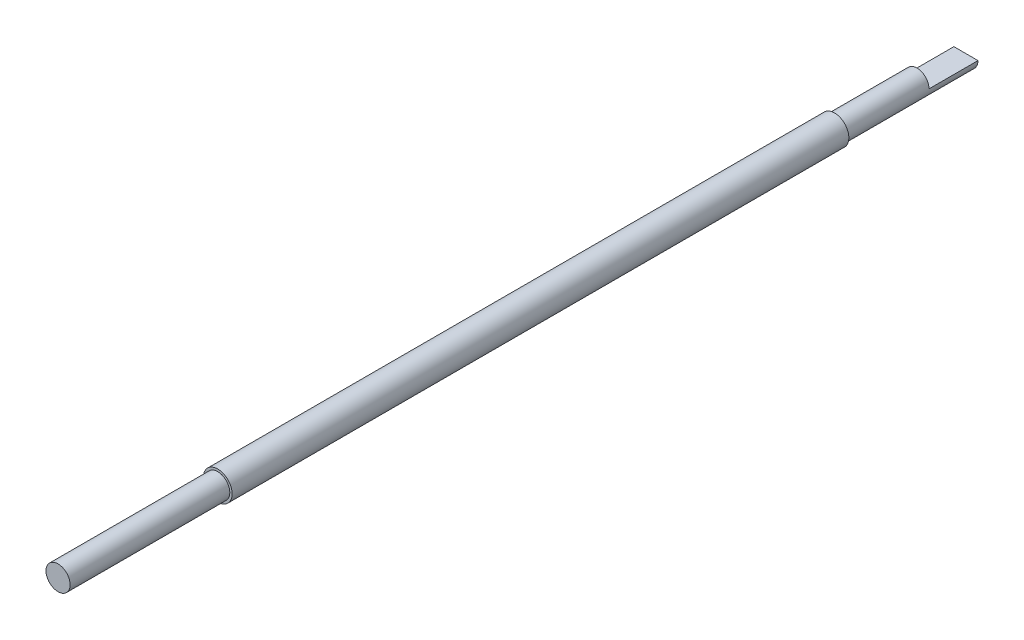
ISO-10303-21;
HEADER;
FILE_DESCRIPTION(('STEP AP214'),'2;1');
FILE_NAME('part.step','',(''),(''),'','','');
FILE_SCHEMA(('AUTOMOTIVE_DESIGN { 1 0 10303 214 1 1 1 1 }'));
ENDSEC;
DATA;
#1=APPLICATION_CONTEXT('core data for automotive mechanical design processes');
#2=APPLICATION_PROTOCOL_DEFINITION('international standard','automotive_design',2000,#1);
#3=PRODUCT_CONTEXT('',#1,'mechanical');
#4=PRODUCT('Part','Part','',(#3));
#5=PRODUCT_RELATED_PRODUCT_CATEGORY('part','',(#4));
#6=PRODUCT_DEFINITION_FORMATION('','',#4);
#7=PRODUCT_DEFINITION_CONTEXT('part definition',#1,'design');
#8=PRODUCT_DEFINITION('design','',#6,#7);
#9=PRODUCT_DEFINITION_SHAPE('','',#8);
#10=(LENGTH_UNIT() NAMED_UNIT(*) SI_UNIT(.MILLI.,.METRE.));
#11=(NAMED_UNIT(*) PLANE_ANGLE_UNIT() SI_UNIT($,.RADIAN.));
#12=(NAMED_UNIT(*) SI_UNIT($,.STERADIAN.) SOLID_ANGLE_UNIT());
#13=UNCERTAINTY_MEASURE_WITH_UNIT(LENGTH_MEASURE(1.E-05),#10,'distance_accuracy_value','');
#14=(GEOMETRIC_REPRESENTATION_CONTEXT(3) GLOBAL_UNCERTAINTY_ASSIGNED_CONTEXT((#13)) GLOBAL_UNIT_ASSIGNED_CONTEXT((#10,
#11,#12)) REPRESENTATION_CONTEXT('',''));
#15=CARTESIAN_POINT('',(0.,0.,0.));
#16=DIRECTION('',(0.,0.,1.));
#17=DIRECTION('',(1.,0.,0.));
#18=AXIS2_PLACEMENT_3D('',#15,#16,#17);
#19=CARTESIAN_POINT('',(0.,0.,301.26));
#20=DIRECTION('',(0.,0.,-1.));
#21=DIRECTION('',(-1.,0.,0.));
#22=AXIS2_PLACEMENT_3D('',#19,#20,#21);
#23=CYLINDRICAL_SURFACE('',#22,4.7625);
#24=CARTESIAN_POINT('',(0.,0.,43.61));
#25=DIRECTION('',(0.,0.,-1.));
#26=DIRECTION('',(-1.,0.,0.));
#27=AXIS2_PLACEMENT_3D('',#24,#25,#26);
#28=CIRCLE('',#27,4.7625);
#29=CARTESIAN_POINT('',(-4.7625,0.,43.61));
#30=VERTEX_POINT('',#29);
#31=EDGE_CURVE('E11',#30,#30,#28,.T.);
#32=ORIENTED_EDGE('',*,*,#31,.F.);
#33=EDGE_LOOP('',(#32));
#34=FACE_BOUND('',#33,.T.);
#35=CARTESIAN_POINT('',(0.,0.,248.26));
#36=DIRECTION('',(0.,0.,1.));
#37=DIRECTION('',(1.,0.,0.));
#38=AXIS2_PLACEMENT_3D('',#35,#36,#37);
#39=CIRCLE('',#38,4.7625);
#40=CARTESIAN_POINT('',(4.7625,0.,248.26));
#41=VERTEX_POINT('',#40);
#42=EDGE_CURVE('E66',#41,#41,#39,.T.);
#43=ORIENTED_EDGE('',*,*,#42,.F.);
#44=EDGE_LOOP('',(#43));
#45=FACE_BOUND('',#44,.T.);
#46=ADVANCED_FACE('F35',(#34,#45),#23,.T.);
#47=CARTESIAN_POINT('',(0.,0.,43.61));
#48=DIRECTION('',(0.,0.,-1.));
#49=DIRECTION('',(-1.,0.,0.));
#50=AXIS2_PLACEMENT_3D('',#47,#48,#49);
#51=PLANE('',#50);
#52=CARTESIAN_POINT('',(0.,0.,43.61));
#53=DIRECTION('',(0.,0.,-1.));
#54=DIRECTION('',(-1.,0.,0.));
#55=AXIS2_PLACEMENT_3D('',#52,#53,#54);
#56=CIRCLE('',#55,4.);
#57=CARTESIAN_POINT('',(-4.,0.,43.61));
#58=VERTEX_POINT('',#57);
#59=EDGE_CURVE('E42',#58,#58,#56,.T.);
#60=ORIENTED_EDGE('',*,*,#59,.F.);
#61=EDGE_LOOP('',(#60));
#62=FACE_BOUND('',#61,.T.);
#63=ORIENTED_EDGE('',*,*,#31,.T.);
#64=EDGE_LOOP('',(#63));
#65=FACE_BOUND('',#64,.T.);
#66=ADVANCED_FACE('F102',(#62,#65),#51,.T.);
#67=CARTESIAN_POINT('',(0.,0.,43.61));
#68=DIRECTION('',(0.,0.,-1.));
#69=DIRECTION('',(-1.,0.,0.));
#70=AXIS2_PLACEMENT_3D('',#67,#68,#69);
#71=CYLINDRICAL_SURFACE('',#70,4.);
#72=DIRECTION('',(0.,0.,-1.));
#73=VECTOR('',#72,1.);
#74=CARTESIAN_POINT('',(-4.,0.,16.26));
#75=LINE('',#74,#73);
#76=CARTESIAN_POINT('',(-4.,0.,16.26));
#77=VERTEX_POINT('',#76);
#78=CARTESIAN_POINT('',(-4.,0.,0.));
#79=VERTEX_POINT('',#78);
#80=EDGE_CURVE('E55',#77,#79,#75,.T.);
#81=ORIENTED_EDGE('',*,*,#80,.T.);
#82=CARTESIAN_POINT('',(0.,0.,0.));
#83=DIRECTION('',(0.,0.,-1.));
#84=DIRECTION('',(-1.,0.,0.));
#85=AXIS2_PLACEMENT_3D('',#82,#83,#84);
#86=CIRCLE('',#85,4.);
#87=CARTESIAN_POINT('',(4.,0.,0.));
#88=VERTEX_POINT('',#87);
#89=EDGE_CURVE('E72',#88,#79,#86,.T.);
#90=ORIENTED_EDGE('',*,*,#89,.F.);
#91=DIRECTION('',(0.,0.,-1.));
#92=VECTOR('',#91,1.);
#93=CARTESIAN_POINT('',(4.,0.,16.26));
#94=LINE('',#93,#92);
#95=CARTESIAN_POINT('',(4.,0.,16.26));
#96=VERTEX_POINT('',#95);
#97=EDGE_CURVE('E49',#96,#88,#94,.T.);
#98=ORIENTED_EDGE('',*,*,#97,.F.);
#99=CARTESIAN_POINT('',(0.,0.,16.26));
#100=DIRECTION('',(0.,0.,-1.));
#101=DIRECTION('',(-1.,0.,0.));
#102=AXIS2_PLACEMENT_3D('',#99,#100,#101);
#103=CIRCLE('',#102,4.);
#104=EDGE_CURVE('E65',#77,#96,#103,.T.);
#105=ORIENTED_EDGE('',*,*,#104,.F.);
#106=EDGE_LOOP('',(#81,#90,#98,#105));
#107=FACE_BOUND('',#106,.T.);
#108=ORIENTED_EDGE('',*,*,#59,.T.);
#109=EDGE_LOOP('',(#108));
#110=FACE_BOUND('',#109,.T.);
#111=ADVANCED_FACE('F70',(#107,#110),#71,.T.);
#112=CARTESIAN_POINT('',(0.,0.,0.));
#113=DIRECTION('',(0.,0.,1.));
#114=DIRECTION('',(1.,0.,0.));
#115=AXIS2_PLACEMENT_3D('',#112,#113,#114);
#116=PLANE('',#115);
#117=ORIENTED_EDGE('',*,*,#89,.T.);
#118=DIRECTION('',(-1.,0.,0.));
#119=VECTOR('',#118,1.);
#120=CARTESIAN_POINT('',(0.,0.,0.));
#121=LINE('',#120,#119);
#122=EDGE_CURVE('E60',#88,#79,#121,.T.);
#123=ORIENTED_EDGE('',*,*,#122,.F.);
#124=EDGE_LOOP('',(#117,#123));
#125=FACE_BOUND('',#124,.T.);
#126=ADVANCED_FACE('F74',(#125),#116,.F.);
#127=CARTESIAN_POINT('',(0.,0.,16.26));
#128=DIRECTION('',(0.,-1.,0.));
#129=DIRECTION('',(0.,0.,-1.));
#130=AXIS2_PLACEMENT_3D('',#127,#128,#129);
#131=PLANE('',#130);
#132=ORIENTED_EDGE('',*,*,#122,.T.);
#133=ORIENTED_EDGE('',*,*,#80,.F.);
#134=DIRECTION('',(-1.,0.,0.));
#135=VECTOR('',#134,1.);
#136=CARTESIAN_POINT('',(0.,0.,16.26));
#137=LINE('',#136,#135);
#138=EDGE_CURVE('E78',#96,#77,#137,.T.);
#139=ORIENTED_EDGE('',*,*,#138,.F.);
#140=ORIENTED_EDGE('',*,*,#97,.T.);
#141=EDGE_LOOP('',(#132,#133,#139,#140));
#142=FACE_BOUND('',#141,.T.);
#143=ADVANCED_FACE('F61',(#142),#131,.F.);
#144=CARTESIAN_POINT('',(0.,0.,16.26));
#145=DIRECTION('',(0.,0.,-1.));
#146=DIRECTION('',(-1.,0.,0.));
#147=AXIS2_PLACEMENT_3D('',#144,#145,#146);
#148=PLANE('',#147);
#149=ORIENTED_EDGE('',*,*,#104,.T.);
#150=ORIENTED_EDGE('',*,*,#138,.T.);
#151=EDGE_LOOP('',(#149,#150));
#152=FACE_BOUND('',#151,.T.);
#153=ADVANCED_FACE('F97',(#152),#148,.T.);
#154=CARTESIAN_POINT('',(0.,0.,248.26));
#155=DIRECTION('',(0.,0.,1.));
#156=DIRECTION('',(1.,0.,0.));
#157=AXIS2_PLACEMENT_3D('',#154,#155,#156);
#158=PLANE('',#157);
#159=CARTESIAN_POINT('',(0.,0.,248.26));
#160=DIRECTION('',(0.,0.,1.));
#161=DIRECTION('',(1.,0.,0.));
#162=AXIS2_PLACEMENT_3D('',#159,#160,#161);
#163=CIRCLE('',#162,4.);
#164=CARTESIAN_POINT('',(4.,0.,248.26));
#165=VERTEX_POINT('',#164);
#166=EDGE_CURVE('E84',#165,#165,#163,.T.);
#167=ORIENTED_EDGE('',*,*,#166,.F.);
#168=EDGE_LOOP('',(#167));
#169=FACE_BOUND('',#168,.T.);
#170=ORIENTED_EDGE('',*,*,#42,.T.);
#171=EDGE_LOOP('',(#170));
#172=FACE_BOUND('',#171,.T.);
#173=ADVANCED_FACE('F94',(#169,#172),#158,.T.);
#174=CARTESIAN_POINT('',(0.,0.,248.26));
#175=DIRECTION('',(0.,0.,1.));
#176=DIRECTION('',(1.,0.,0.));
#177=AXIS2_PLACEMENT_3D('',#174,#175,#176);
#178=CYLINDRICAL_SURFACE('',#177,4.);
#179=ORIENTED_EDGE('',*,*,#166,.T.);
#180=EDGE_LOOP('',(#179));
#181=FACE_BOUND('',#180,.T.);
#182=CARTESIAN_POINT('',(0.,0.,301.26));
#183=DIRECTION('',(0.,0.,1.));
#184=DIRECTION('',(1.,0.,0.));
#185=AXIS2_PLACEMENT_3D('',#182,#183,#184);
#186=CIRCLE('',#185,4.);
#187=CARTESIAN_POINT('',(4.,0.,301.26));
#188=VERTEX_POINT('',#187);
#189=EDGE_CURVE('E85',#188,#188,#186,.T.);
#190=ORIENTED_EDGE('',*,*,#189,.F.);
#191=EDGE_LOOP('',(#190));
#192=FACE_BOUND('',#191,.T.);
#193=ADVANCED_FACE('F91',(#181,#192),#178,.T.);
#194=CARTESIAN_POINT('',(0.,0.,301.26));
#195=DIRECTION('',(0.,0.,1.));
#196=DIRECTION('',(1.,0.,0.));
#197=AXIS2_PLACEMENT_3D('',#194,#195,#196);
#198=PLANE('',#197);
#199=ORIENTED_EDGE('',*,*,#189,.T.);
#200=EDGE_LOOP('',(#199));
#201=FACE_BOUND('',#200,.T.);
#202=ADVANCED_FACE('F118',(#201),#198,.T.);
#203=CLOSED_SHELL('',(#46,#66,#111,#126,#143,#153,#173,#193,#202));
#204=MANIFOLD_SOLID_BREP('B2',#203);
#205=ADVANCED_BREP_SHAPE_REPRESENTATION('',(#18,#204),#14);
#206=SHAPE_DEFINITION_REPRESENTATION(#9,#205);
ENDSEC;
END-ISO-10303-21;
